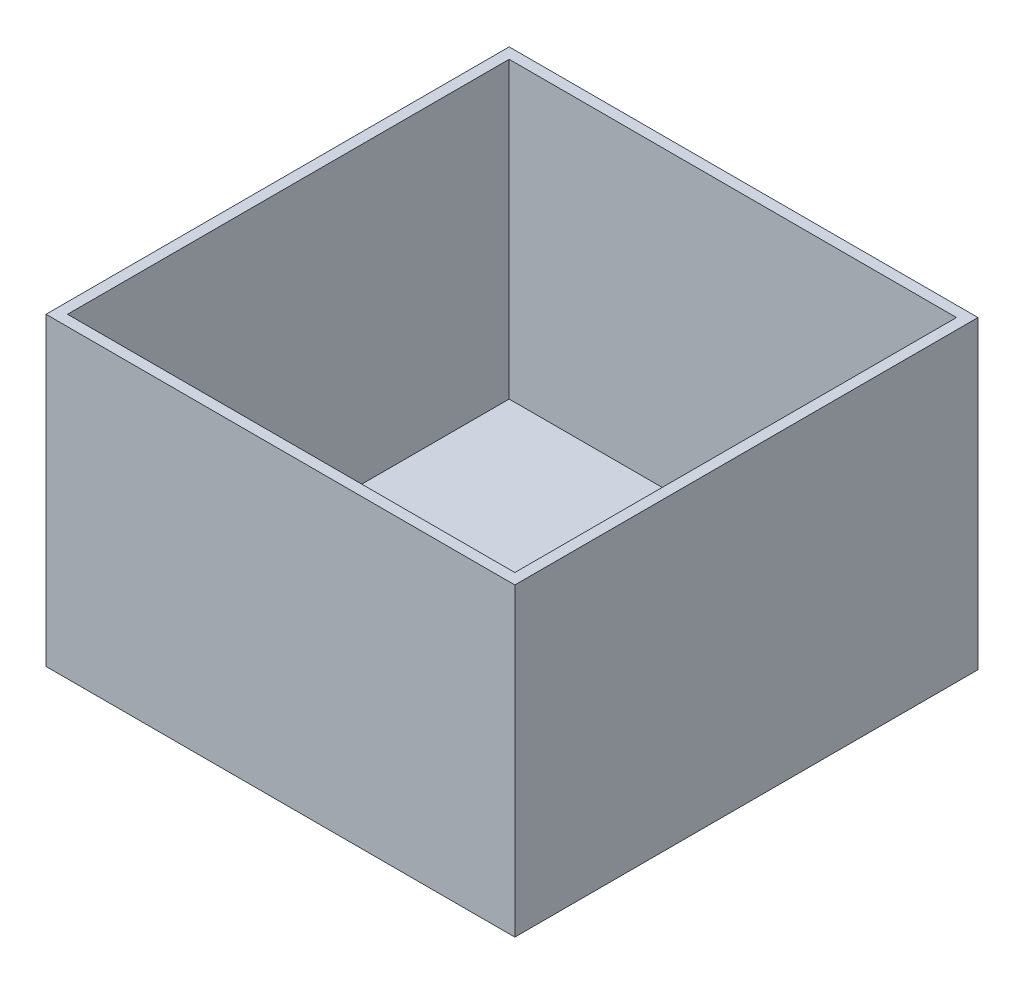
ISO-10303-21;
HEADER;
FILE_DESCRIPTION(('STEP AP214'),'2;1');
FILE_NAME('part.step','',(''),(''),'','','');
FILE_SCHEMA(('AUTOMOTIVE_DESIGN { 1 0 10303 214 1 1 1 1 }'));
ENDSEC;
DATA;
#1=APPLICATION_CONTEXT('core data for automotive mechanical design processes');
#2=APPLICATION_PROTOCOL_DEFINITION('international standard','automotive_design',2000,#1);
#3=PRODUCT_CONTEXT('',#1,'mechanical');
#4=PRODUCT('Part','Part','',(#3));
#5=PRODUCT_RELATED_PRODUCT_CATEGORY('part','',(#4));
#6=PRODUCT_DEFINITION_FORMATION('','',#4);
#7=PRODUCT_DEFINITION_CONTEXT('part definition',#1,'design');
#8=PRODUCT_DEFINITION('design','',#6,#7);
#9=PRODUCT_DEFINITION_SHAPE('','',#8);
#10=(LENGTH_UNIT() NAMED_UNIT(*) SI_UNIT(.MILLI.,.METRE.));
#11=(NAMED_UNIT(*) PLANE_ANGLE_UNIT() SI_UNIT($,.RADIAN.));
#12=(NAMED_UNIT(*) SI_UNIT($,.STERADIAN.) SOLID_ANGLE_UNIT());
#13=UNCERTAINTY_MEASURE_WITH_UNIT(LENGTH_MEASURE(1.E-05),#10,'distance_accuracy_value','');
#14=(GEOMETRIC_REPRESENTATION_CONTEXT(3) GLOBAL_UNCERTAINTY_ASSIGNED_CONTEXT((#13)) GLOBAL_UNIT_ASSIGNED_CONTEXT((#10,
#11,#12)) REPRESENTATION_CONTEXT('',''));
#15=CARTESIAN_POINT('',(0.,0.,0.));
#16=DIRECTION('',(0.,0.,1.));
#17=DIRECTION('',(1.,0.,0.));
#18=AXIS2_PLACEMENT_3D('',#15,#16,#17);
#19=CARTESIAN_POINT('',(-207.5,270.,-205.));
#20=DIRECTION('',(1.,0.,0.));
#21=DIRECTION('',(0.,0.,-1.));
#22=AXIS2_PLACEMENT_3D('',#19,#20,#21);
#23=PLANE('',#22);
#24=DIRECTION('',(0.,0.,1.));
#25=VECTOR('',#24,1.);
#26=CARTESIAN_POINT('',(-207.5,0.,-205.));
#27=LINE('',#26,#25);
#28=CARTESIAN_POINT('',(-207.5,0.,-205.));
#29=VERTEX_POINT('',#28);
#30=CARTESIAN_POINT('',(-207.5,0.,205.));
#31=VERTEX_POINT('',#30);
#32=EDGE_CURVE('E146',#29,#31,#27,.T.);
#33=ORIENTED_EDGE('',*,*,#32,.T.);
#34=DIRECTION('',(0.,-1.,0.));
#35=VECTOR('',#34,1.);
#36=CARTESIAN_POINT('',(-207.5,270.,205.));
#37=LINE('',#36,#35);
#38=CARTESIAN_POINT('',(-207.5,270.,205.));
#39=VERTEX_POINT('',#38);
#40=EDGE_CURVE('E11',#39,#31,#37,.T.);
#41=ORIENTED_EDGE('',*,*,#40,.F.);
#42=DIRECTION('',(0.,0.,1.));
#43=VECTOR('',#42,1.);
#44=CARTESIAN_POINT('',(-207.5,270.,-205.));
#45=LINE('',#44,#43);
#46=CARTESIAN_POINT('',(-207.5,270.,-205.));
#47=VERTEX_POINT('',#46);
#48=EDGE_CURVE('E150',#47,#39,#45,.T.);
#49=ORIENTED_EDGE('',*,*,#48,.F.);
#50=DIRECTION('',(0.,-1.,0.));
#51=VECTOR('',#50,1.);
#52=CARTESIAN_POINT('',(-207.5,270.,-205.));
#53=LINE('',#52,#51);
#54=EDGE_CURVE('E156',#47,#29,#53,.T.);
#55=ORIENTED_EDGE('',*,*,#54,.T.);
#56=EDGE_LOOP('',(#33,#41,#49,#55));
#57=FACE_BOUND('',#56,.T.);
#58=ADVANCED_FACE('F38',(#57),#23,.F.);
#59=CARTESIAN_POINT('',(207.5,270.,205.));
#60=DIRECTION('',(0.,0.,-1.));
#61=DIRECTION('',(-1.,0.,0.));
#62=AXIS2_PLACEMENT_3D('',#59,#60,#61);
#63=PLANE('',#62);
#64=DIRECTION('',(1.,0.,0.));
#65=VECTOR('',#64,1.);
#66=CARTESIAN_POINT('',(207.5,0.,205.));
#67=LINE('',#66,#65);
#68=CARTESIAN_POINT('',(207.5,0.,205.));
#69=VERTEX_POINT('',#68);
#70=EDGE_CURVE('E159',#31,#69,#67,.T.);
#71=ORIENTED_EDGE('',*,*,#70,.T.);
#72=DIRECTION('',(0.,-1.,0.));
#73=VECTOR('',#72,1.);
#74=CARTESIAN_POINT('',(207.5,270.,205.));
#75=LINE('',#74,#73);
#76=CARTESIAN_POINT('',(207.5,270.,205.));
#77=VERTEX_POINT('',#76);
#78=EDGE_CURVE('E45',#77,#69,#75,.T.);
#79=ORIENTED_EDGE('',*,*,#78,.F.);
#80=DIRECTION('',(1.,0.,0.));
#81=VECTOR('',#80,1.);
#82=CARTESIAN_POINT('',(207.5,270.,205.));
#83=LINE('',#82,#81);
#84=EDGE_CURVE('E89',#39,#77,#83,.T.);
#85=ORIENTED_EDGE('',*,*,#84,.F.);
#86=ORIENTED_EDGE('',*,*,#40,.T.);
#87=EDGE_LOOP('',(#71,#79,#85,#86));
#88=FACE_BOUND('',#87,.T.);
#89=ADVANCED_FACE('F188',(#88),#63,.F.);
#90=CARTESIAN_POINT('',(207.5,270.,-205.));
#91=DIRECTION('',(-1.,0.,0.));
#92=DIRECTION('',(0.,0.,1.));
#93=AXIS2_PLACEMENT_3D('',#90,#91,#92);
#94=PLANE('',#93);
#95=DIRECTION('',(0.,0.,-1.));
#96=VECTOR('',#95,1.);
#97=CARTESIAN_POINT('',(207.5,0.,-205.));
#98=LINE('',#97,#96);
#99=CARTESIAN_POINT('',(207.5,0.,-205.));
#100=VERTEX_POINT('',#99);
#101=EDGE_CURVE('E161',#69,#100,#98,.T.);
#102=ORIENTED_EDGE('',*,*,#101,.T.);
#103=DIRECTION('',(0.,-1.,0.));
#104=VECTOR('',#103,1.);
#105=CARTESIAN_POINT('',(207.5,270.,-205.));
#106=LINE('',#105,#104);
#107=CARTESIAN_POINT('',(207.5,270.,-205.));
#108=VERTEX_POINT('',#107);
#109=EDGE_CURVE('E165',#108,#100,#106,.T.);
#110=ORIENTED_EDGE('',*,*,#109,.F.);
#111=DIRECTION('',(0.,0.,-1.));
#112=VECTOR('',#111,1.);
#113=CARTESIAN_POINT('',(207.5,270.,-205.));
#114=LINE('',#113,#112);
#115=EDGE_CURVE('E153',#77,#108,#114,.T.);
#116=ORIENTED_EDGE('',*,*,#115,.F.);
#117=ORIENTED_EDGE('',*,*,#78,.T.);
#118=EDGE_LOOP('',(#102,#110,#116,#117));
#119=FACE_BOUND('',#118,.T.);
#120=ADVANCED_FACE('F170',(#119),#94,.F.);
#121=CARTESIAN_POINT('',(207.5,270.,-205.));
#122=DIRECTION('',(0.,0.,1.));
#123=DIRECTION('',(1.,0.,0.));
#124=AXIS2_PLACEMENT_3D('',#121,#122,#123);
#125=PLANE('',#124);
#126=DIRECTION('',(-1.,0.,0.));
#127=VECTOR('',#126,1.);
#128=CARTESIAN_POINT('',(207.5,0.,-205.));
#129=LINE('',#128,#127);
#130=EDGE_CURVE('E82',#100,#29,#129,.T.);
#131=ORIENTED_EDGE('',*,*,#130,.T.);
#132=ORIENTED_EDGE('',*,*,#54,.F.);
#133=DIRECTION('',(-1.,0.,0.));
#134=VECTOR('',#133,1.);
#135=CARTESIAN_POINT('',(207.5,270.,-205.));
#136=LINE('',#135,#134);
#137=EDGE_CURVE('E61',#108,#47,#136,.T.);
#138=ORIENTED_EDGE('',*,*,#137,.F.);
#139=ORIENTED_EDGE('',*,*,#109,.T.);
#140=EDGE_LOOP('',(#131,#132,#138,#139));
#141=FACE_BOUND('',#140,.T.);
#142=ADVANCED_FACE('F178',(#141),#125,.F.);
#143=CARTESIAN_POINT('',(0.,270.,0.));
#144=DIRECTION('',(0.,-1.,0.));
#145=DIRECTION('',(0.,0.,-1.));
#146=AXIS2_PLACEMENT_3D('',#143,#144,#145);
#147=PLANE('',#146);
#148=DIRECTION('',(0.,0.,1.));
#149=VECTOR('',#148,1.);
#150=CARTESIAN_POINT('',(-197.975,270.,-195.475));
#151=LINE('',#150,#149);
#152=CARTESIAN_POINT('',(-197.975,270.,-195.475));
#153=VERTEX_POINT('',#152);
#154=CARTESIAN_POINT('',(-197.975,270.,195.475));
#155=VERTEX_POINT('',#154);
#156=EDGE_CURVE('E140',#153,#155,#151,.T.);
#157=ORIENTED_EDGE('',*,*,#156,.F.);
#158=DIRECTION('',(-1.,0.,0.));
#159=VECTOR('',#158,1.);
#160=CARTESIAN_POINT('',(197.975,270.,-195.475));
#161=LINE('',#160,#159);
#162=CARTESIAN_POINT('',(197.975,270.,-195.475));
#163=VERTEX_POINT('',#162);
#164=EDGE_CURVE('E52',#163,#153,#161,.T.);
#165=ORIENTED_EDGE('',*,*,#164,.F.);
#166=DIRECTION('',(0.,0.,-1.));
#167=VECTOR('',#166,1.);
#168=CARTESIAN_POINT('',(197.975,270.,195.475));
#169=LINE('',#168,#167);
#170=CARTESIAN_POINT('',(197.975,270.,195.475));
#171=VERTEX_POINT('',#170);
#172=EDGE_CURVE('E131',#171,#163,#169,.T.);
#173=ORIENTED_EDGE('',*,*,#172,.F.);
#174=DIRECTION('',(1.,0.,0.));
#175=VECTOR('',#174,1.);
#176=CARTESIAN_POINT('',(-197.975,270.,195.475));
#177=LINE('',#176,#175);
#178=EDGE_CURVE('E134',#155,#171,#177,.T.);
#179=ORIENTED_EDGE('',*,*,#178,.F.);
#180=EDGE_LOOP('',(#157,#165,#173,#179));
#181=FACE_BOUND('',#180,.T.);
#182=ORIENTED_EDGE('',*,*,#48,.T.);
#183=ORIENTED_EDGE('',*,*,#84,.T.);
#184=ORIENTED_EDGE('',*,*,#115,.T.);
#185=ORIENTED_EDGE('',*,*,#137,.T.);
#186=EDGE_LOOP('',(#182,#183,#184,#185));
#187=FACE_BOUND('',#186,.T.);
#188=ADVANCED_FACE('F180',(#181,#187),#147,.F.);
#189=CARTESIAN_POINT('',(0.,0.,0.));
#190=DIRECTION('',(0.,-1.,0.));
#191=DIRECTION('',(0.,0.,-1.));
#192=AXIS2_PLACEMENT_3D('',#189,#190,#191);
#193=PLANE('',#192);
#194=ORIENTED_EDGE('',*,*,#32,.F.);
#195=ORIENTED_EDGE('',*,*,#130,.F.);
#196=ORIENTED_EDGE('',*,*,#101,.F.);
#197=ORIENTED_EDGE('',*,*,#70,.F.);
#198=EDGE_LOOP('',(#194,#195,#196,#197));
#199=FACE_BOUND('',#198,.T.);
#200=ADVANCED_FACE('F174',(#199),#193,.T.);
#201=CARTESIAN_POINT('',(197.975,9.52500000000001,-195.475));
#202=DIRECTION('',(0.,0.,-1.));
#203=DIRECTION('',(-1.,0.,0.));
#204=AXIS2_PLACEMENT_3D('',#201,#202,#203);
#205=PLANE('',#204);
#206=ORIENTED_EDGE('',*,*,#164,.T.);
#207=DIRECTION('',(0.,1.,0.));
#208=VECTOR('',#207,1.);
#209=CARTESIAN_POINT('',(-197.975,9.52500000000001,-195.475));
#210=LINE('',#209,#208);
#211=CARTESIAN_POINT('',(-197.975,9.52500000000001,-195.475));
#212=VERTEX_POINT('',#211);
#213=EDGE_CURVE('E109',#212,#153,#210,.T.);
#214=ORIENTED_EDGE('',*,*,#213,.F.);
#215=DIRECTION('',(-1.,0.,0.));
#216=VECTOR('',#215,1.);
#217=CARTESIAN_POINT('',(197.975,9.52500000000001,-195.475));
#218=LINE('',#217,#216);
#219=CARTESIAN_POINT('',(197.975,9.52500000000001,-195.475));
#220=VERTEX_POINT('',#219);
#221=EDGE_CURVE('E113',#220,#212,#218,.T.);
#222=ORIENTED_EDGE('',*,*,#221,.F.);
#223=DIRECTION('',(0.,1.,0.));
#224=VECTOR('',#223,1.);
#225=CARTESIAN_POINT('',(197.975,9.52500000000001,-195.475));
#226=LINE('',#225,#224);
#227=EDGE_CURVE('E144',#220,#163,#226,.T.);
#228=ORIENTED_EDGE('',*,*,#227,.T.);
#229=EDGE_LOOP('',(#206,#214,#222,#228));
#230=FACE_BOUND('',#229,.T.);
#231=ADVANCED_FACE('F111',(#230),#205,.F.);
#232=CARTESIAN_POINT('',(197.975,9.52500000000001,195.475));
#233=DIRECTION('',(1.,0.,0.));
#234=DIRECTION('',(0.,0.,-1.));
#235=AXIS2_PLACEMENT_3D('',#232,#233,#234);
#236=PLANE('',#235);
#237=ORIENTED_EDGE('',*,*,#172,.T.);
#238=ORIENTED_EDGE('',*,*,#227,.F.);
#239=DIRECTION('',(0.,0.,-1.));
#240=VECTOR('',#239,1.);
#241=CARTESIAN_POINT('',(197.975,9.52500000000001,195.475));
#242=LINE('',#241,#240);
#243=CARTESIAN_POINT('',(197.975,9.52500000000001,195.475));
#244=VERTEX_POINT('',#243);
#245=EDGE_CURVE('E119',#244,#220,#242,.T.);
#246=ORIENTED_EDGE('',*,*,#245,.F.);
#247=DIRECTION('',(0.,1.,0.));
#248=VECTOR('',#247,1.);
#249=CARTESIAN_POINT('',(197.975,9.52500000000001,195.475));
#250=LINE('',#249,#248);
#251=EDGE_CURVE('E147',#244,#171,#250,.T.);
#252=ORIENTED_EDGE('',*,*,#251,.T.);
#253=EDGE_LOOP('',(#237,#238,#246,#252));
#254=FACE_BOUND('',#253,.T.);
#255=ADVANCED_FACE('F231',(#254),#236,.F.);
#256=CARTESIAN_POINT('',(-197.975,9.52500000000001,195.475));
#257=DIRECTION('',(0.,0.,1.));
#258=DIRECTION('',(1.,0.,0.));
#259=AXIS2_PLACEMENT_3D('',#256,#257,#258);
#260=PLANE('',#259);
#261=ORIENTED_EDGE('',*,*,#178,.T.);
#262=ORIENTED_EDGE('',*,*,#251,.F.);
#263=DIRECTION('',(1.,0.,0.));
#264=VECTOR('',#263,1.);
#265=CARTESIAN_POINT('',(-197.975,9.52500000000001,195.475));
#266=LINE('',#265,#264);
#267=CARTESIAN_POINT('',(-197.975,9.52500000000001,195.475));
#268=VERTEX_POINT('',#267);
#269=EDGE_CURVE('E127',#268,#244,#266,.T.);
#270=ORIENTED_EDGE('',*,*,#269,.F.);
#271=DIRECTION('',(0.,1.,0.));
#272=VECTOR('',#271,1.);
#273=CARTESIAN_POINT('',(-197.975,9.52500000000001,195.475));
#274=LINE('',#273,#272);
#275=EDGE_CURVE('E118',#268,#155,#274,.T.);
#276=ORIENTED_EDGE('',*,*,#275,.T.);
#277=EDGE_LOOP('',(#261,#262,#270,#276));
#278=FACE_BOUND('',#277,.T.);
#279=ADVANCED_FACE('F241',(#278),#260,.F.);
#280=CARTESIAN_POINT('',(-197.975,9.52500000000001,-195.475));
#281=DIRECTION('',(-1.,0.,0.));
#282=DIRECTION('',(0.,0.,1.));
#283=AXIS2_PLACEMENT_3D('',#280,#281,#282);
#284=PLANE('',#283);
#285=ORIENTED_EDGE('',*,*,#156,.T.);
#286=ORIENTED_EDGE('',*,*,#275,.F.);
#287=DIRECTION('',(0.,0.,1.));
#288=VECTOR('',#287,1.);
#289=CARTESIAN_POINT('',(-197.975,9.52500000000001,-195.475));
#290=LINE('',#289,#288);
#291=EDGE_CURVE('E122',#212,#268,#290,.T.);
#292=ORIENTED_EDGE('',*,*,#291,.F.);
#293=ORIENTED_EDGE('',*,*,#213,.T.);
#294=EDGE_LOOP('',(#285,#286,#292,#293));
#295=FACE_BOUND('',#294,.T.);
#296=ADVANCED_FACE('F123',(#295),#284,.F.);
#297=CARTESIAN_POINT('',(0.,9.52500000000001,0.));
#298=DIRECTION('',(0.,1.,0.));
#299=DIRECTION('',(0.,0.,1.));
#300=AXIS2_PLACEMENT_3D('',#297,#298,#299);
#301=PLANE('',#300);
#302=ORIENTED_EDGE('',*,*,#221,.T.);
#303=ORIENTED_EDGE('',*,*,#291,.T.);
#304=ORIENTED_EDGE('',*,*,#269,.T.);
#305=ORIENTED_EDGE('',*,*,#245,.T.);
#306=EDGE_LOOP('',(#302,#303,#304,#305));
#307=FACE_BOUND('',#306,.T.);
#308=ADVANCED_FACE('F129',(#307),#301,.T.);
#309=CLOSED_SHELL('',(#58,#89,#120,#142,#188,#200,#231,#255,#279,#296,#308));
#310=MANIFOLD_SOLID_BREP('B2',#309);
#311=ADVANCED_BREP_SHAPE_REPRESENTATION('',(#18,#310),#14);
#312=SHAPE_DEFINITION_REPRESENTATION(#9,#311);
ENDSEC;
END-ISO-10303-21;
